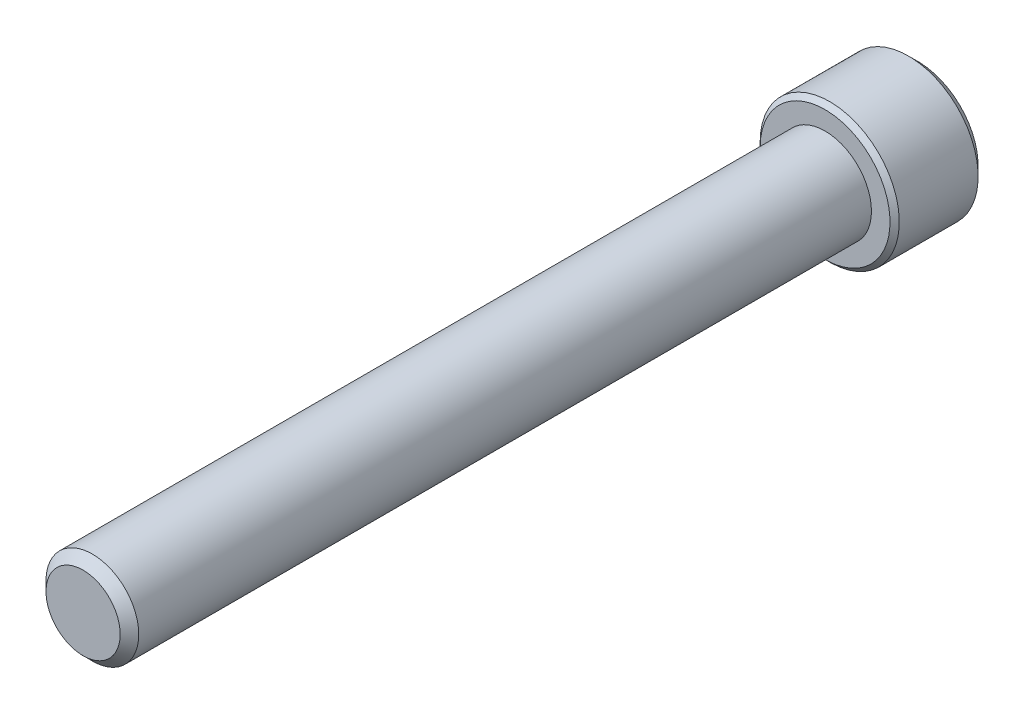
ISO-10303-21;
HEADER;
FILE_DESCRIPTION(('STEP AP214'),'2;1');
FILE_NAME('part.step','',(''),(''),'','','');
FILE_SCHEMA(('AUTOMOTIVE_DESIGN { 1 0 10303 214 1 1 1 1 }'));
ENDSEC;
DATA;
#1=APPLICATION_CONTEXT('core data for automotive mechanical design processes');
#2=APPLICATION_PROTOCOL_DEFINITION('international standard','automotive_design',2000,#1);
#3=PRODUCT_CONTEXT('',#1,'mechanical');
#4=PRODUCT('Part','Part','',(#3));
#5=PRODUCT_RELATED_PRODUCT_CATEGORY('part','',(#4));
#6=PRODUCT_DEFINITION_FORMATION('','',#4);
#7=PRODUCT_DEFINITION_CONTEXT('part definition',#1,'design');
#8=PRODUCT_DEFINITION('design','',#6,#7);
#9=PRODUCT_DEFINITION_SHAPE('','',#8);
#10=(LENGTH_UNIT() NAMED_UNIT(*) SI_UNIT(.MILLI.,.METRE.));
#11=(NAMED_UNIT(*) PLANE_ANGLE_UNIT() SI_UNIT($,.RADIAN.));
#12=(NAMED_UNIT(*) SI_UNIT($,.STERADIAN.) SOLID_ANGLE_UNIT());
#13=UNCERTAINTY_MEASURE_WITH_UNIT(LENGTH_MEASURE(1.E-05),#10,'distance_accuracy_value','');
#14=(GEOMETRIC_REPRESENTATION_CONTEXT(3) GLOBAL_UNCERTAINTY_ASSIGNED_CONTEXT((#13)) GLOBAL_UNIT_ASSIGNED_CONTEXT((#10,
#11,#12)) REPRESENTATION_CONTEXT('',''));
#15=CARTESIAN_POINT('',(0.,0.,0.));
#16=DIRECTION('',(0.,0.,1.));
#17=DIRECTION('',(1.,0.,0.));
#18=AXIS2_PLACEMENT_3D('',#15,#16,#17);
#19=CARTESIAN_POINT('',(0.,0.,-63.5));
#20=DIRECTION('',(0.,0.,1.));
#21=DIRECTION('',(1.,0.,0.));
#22=AXIS2_PLACEMENT_3D('',#19,#20,#21);
#23=CYLINDRICAL_SURFACE('',#22,3.96875);
#24=CARTESIAN_POINT('',(0.,0.,-63.5));
#25=DIRECTION('',(0.,0.,-1.));
#26=DIRECTION('',(-1.,0.,0.));
#27=AXIS2_PLACEMENT_3D('',#24,#25,#26);
#28=CIRCLE('',#27,3.96875);
#29=CARTESIAN_POINT('',(-3.96875,0.,-63.5));
#30=VERTEX_POINT('',#29);
#31=EDGE_CURVE('E210',#30,#30,#28,.F.);
#32=ORIENTED_EDGE('',*,*,#31,.T.);
#33=EDGE_LOOP('',(#32));
#34=FACE_BOUND('',#33,.T.);
#35=CARTESIAN_POINT('',(0.,0.,-0.793749999999996));
#36=DIRECTION('',(0.,0.,1.));
#37=DIRECTION('',(1.,0.,0.));
#38=AXIS2_PLACEMENT_3D('',#35,#36,#37);
#39=CIRCLE('',#38,3.96875);
#40=CARTESIAN_POINT('',(3.96875,0.,-0.793749999999996));
#41=VERTEX_POINT('',#40);
#42=EDGE_CURVE('E109',#41,#41,#39,.F.);
#43=ORIENTED_EDGE('',*,*,#42,.T.);
#44=EDGE_LOOP('',(#43));
#45=FACE_BOUND('',#44,.T.);
#46=ADVANCED_FACE('F35',(#34,#45),#23,.T.);
#47=CARTESIAN_POINT('',(0.,0.,0.));
#48=DIRECTION('',(0.,0.,1.));
#49=DIRECTION('',(1.,0.,0.));
#50=AXIS2_PLACEMENT_3D('',#47,#48,#49);
#51=PLANE('',#50);
#52=CARTESIAN_POINT('',(0.,0.,0.));
#53=DIRECTION('',(0.,0.,1.));
#54=DIRECTION('',(1.,0.,0.));
#55=AXIS2_PLACEMENT_3D('',#52,#53,#54);
#56=CIRCLE('',#55,3.175);
#57=CARTESIAN_POINT('',(3.175,0.,0.));
#58=VERTEX_POINT('',#57);
#59=EDGE_CURVE('E209',#58,#58,#56,.T.);
#60=ORIENTED_EDGE('',*,*,#59,.T.);
#61=EDGE_LOOP('',(#60));
#62=FACE_BOUND('',#61,.T.);
#63=ADVANCED_FACE('F186',(#62),#51,.T.);
#64=CARTESIAN_POINT('',(0.,0.,0.));
#65=DIRECTION('',(0.,0.,-1.));
#66=DIRECTION('',(-1.,0.,0.));
#67=AXIS2_PLACEMENT_3D('',#64,#65,#66);
#68=CONICAL_SURFACE('',#67,3.175,0.785398163397448);
#69=ORIENTED_EDGE('',*,*,#42,.F.);
#70=EDGE_LOOP('',(#69));
#71=FACE_BOUND('',#70,.T.);
#72=ORIENTED_EDGE('',*,*,#59,.F.);
#73=EDGE_LOOP('',(#72));
#74=FACE_BOUND('',#73,.T.);
#75=ADVANCED_FACE('F192',(#71,#74),#68,.T.);
#76=CARTESIAN_POINT('',(0.,0.,-71.4375));
#77=DIRECTION('',(0.,0.,1.));
#78=DIRECTION('',(1.,0.,0.));
#79=AXIS2_PLACEMENT_3D('',#76,#77,#78);
#80=CYLINDRICAL_SURFACE('',#79,5.953125);
#81=CARTESIAN_POINT('',(0.,0.,-63.896875));
#82=DIRECTION('',(0.,0.,-1.));
#83=DIRECTION('',(-1.,0.,0.));
#84=AXIS2_PLACEMENT_3D('',#81,#82,#83);
#85=CIRCLE('',#84,5.953125);
#86=CARTESIAN_POINT('',(-5.953125,0.,-63.896875));
#87=VERTEX_POINT('',#86);
#88=EDGE_CURVE('E43',#87,#87,#85,.T.);
#89=ORIENTED_EDGE('',*,*,#88,.T.);
#90=EDGE_LOOP('',(#89));
#91=FACE_BOUND('',#90,.T.);
#92=CARTESIAN_POINT('',(0.,0.,-70.64375));
#93=DIRECTION('',(0.,0.,-1.));
#94=DIRECTION('',(-1.,0.,0.));
#95=AXIS2_PLACEMENT_3D('',#92,#93,#94);
#96=CIRCLE('',#95,5.953125);
#97=CARTESIAN_POINT('',(-5.953125,0.,-70.64375));
#98=VERTEX_POINT('',#97);
#99=EDGE_CURVE('E169',#98,#98,#96,.F.);
#100=ORIENTED_EDGE('',*,*,#99,.T.);
#101=EDGE_LOOP('',(#100));
#102=FACE_BOUND('',#101,.T.);
#103=ADVANCED_FACE('F174',(#91,#102),#80,.T.);
#104=CARTESIAN_POINT('',(0.,0.,-71.4375));
#105=DIRECTION('',(0.,0.,-1.));
#106=DIRECTION('',(-1.,0.,0.));
#107=AXIS2_PLACEMENT_3D('',#104,#105,#106);
#108=PLANE('',#107);
#109=CARTESIAN_POINT('',(0.,0.,-71.4375));
#110=DIRECTION('',(0.,0.,-1.));
#111=DIRECTION('',(-1.,0.,0.));
#112=AXIS2_PLACEMENT_3D('',#109,#110,#111);
#113=CIRCLE('',#112,5.159375);
#114=CARTESIAN_POINT('',(-5.159375,0.,-71.4375));
#115=VERTEX_POINT('',#114);
#116=EDGE_CURVE('E108',#115,#115,#113,.T.);
#117=ORIENTED_EDGE('',*,*,#116,.T.);
#118=EDGE_LOOP('',(#117));
#119=FACE_BOUND('',#118,.T.);
#120=CARTESIAN_POINT('',(0.,0.,-71.4375));
#121=DIRECTION('',(0.,0.,-1.));
#122=DIRECTION('',(-1.,0.,0.));
#123=AXIS2_PLACEMENT_3D('',#120,#121,#122);
#124=CIRCLE('',#123,3.66617420935412);
#125=CARTESIAN_POINT('',(-3.175,1.83308710467706,-71.4375));
#126=VERTEX_POINT('',#125);
#127=CARTESIAN_POINT('',(0.,3.66617420935412,-71.4375));
#128=VERTEX_POINT('',#127);
#129=EDGE_CURVE('E89',#126,#128,#124,.T.);
#130=ORIENTED_EDGE('',*,*,#129,.F.);
#131=CARTESIAN_POINT('',(-3.175,-1.83308710467706,-71.4375));
#132=VERTEX_POINT('',#131);
#133=EDGE_CURVE('E49',#132,#126,#124,.T.);
#134=ORIENTED_EDGE('',*,*,#133,.F.);
#135=CARTESIAN_POINT('',(0.,-3.66617420935412,-71.4375));
#136=VERTEX_POINT('',#135);
#137=EDGE_CURVE('E265',#136,#132,#124,.T.);
#138=ORIENTED_EDGE('',*,*,#137,.F.);
#139=CARTESIAN_POINT('',(3.175,-1.83308710467706,-71.4375));
#140=VERTEX_POINT('',#139);
#141=EDGE_CURVE('E56',#140,#136,#124,.T.);
#142=ORIENTED_EDGE('',*,*,#141,.F.);
#143=CARTESIAN_POINT('',(3.175,1.83308710467706,-71.4375));
#144=VERTEX_POINT('',#143);
#145=EDGE_CURVE('E130',#144,#140,#124,.T.);
#146=ORIENTED_EDGE('',*,*,#145,.F.);
#147=EDGE_CURVE('E98',#128,#144,#124,.T.);
#148=ORIENTED_EDGE('',*,*,#147,.F.);
#149=EDGE_LOOP('',(#130,#134,#138,#142,#146,#148));
#150=FACE_BOUND('',#149,.T.);
#151=ADVANCED_FACE('F129',(#119,#150),#108,.T.);
#152=CARTESIAN_POINT('',(0.,0.,-63.5));
#153=DIRECTION('',(0.,0.,-1.));
#154=DIRECTION('',(-1.,0.,0.));
#155=AXIS2_PLACEMENT_3D('',#152,#153,#154);
#156=PLANE('',#155);
#157=CARTESIAN_POINT('',(0.,0.,-63.5));
#158=DIRECTION('',(0.,0.,-1.));
#159=DIRECTION('',(-1.,0.,0.));
#160=AXIS2_PLACEMENT_3D('',#157,#158,#159);
#161=CIRCLE('',#160,5.55625);
#162=CARTESIAN_POINT('',(-5.55625,0.,-63.5));
#163=VERTEX_POINT('',#162);
#164=EDGE_CURVE('E11',#163,#163,#161,.F.);
#165=ORIENTED_EDGE('',*,*,#164,.T.);
#166=EDGE_LOOP('',(#165));
#167=FACE_BOUND('',#166,.T.);
#168=ORIENTED_EDGE('',*,*,#31,.F.);
#169=EDGE_LOOP('',(#168));
#170=FACE_BOUND('',#169,.T.);
#171=ADVANCED_FACE('F277',(#167,#170),#156,.F.);
#172=CARTESIAN_POINT('',(0.,0.,-71.4375));
#173=DIRECTION('',(0.,0.,-1.));
#174=DIRECTION('',(-1.,0.,0.));
#175=AXIS2_PLACEMENT_3D('',#172,#173,#174);
#176=CONICAL_SURFACE('',#175,3.66617420935412,0.78539816339745);
#177=ORIENTED_EDGE('',*,*,#147,.T.);
#178=CARTESIAN_POINT('',(-0.000200000000000376,3.66628967940796,-71.4376154755089));
#179=CARTESIAN_POINT('',(0.108938349949823,3.60327862368552,-71.3746589836918));
#180=CARTESIAN_POINT('',(0.21990162807794,3.53921394518809,-71.3154001042347));
#181=CARTESIAN_POINT('',(0.44616784634594,3.40857908316254,-71.2068986557306));
#182=CARTESIAN_POINT('',(0.561492303252257,3.34199647692353,-71.1577164539387));
#183=CARTESIAN_POINT('',(0.79403852248062,3.207735854653,-71.073466458874));
#184=CARTESIAN_POINT('',(0.911201066281143,3.14009202845083,-71.0381869144994));
#185=CARTESIAN_POINT('',(1.14810544464627,3.00331522182952,-70.9838315701348));
#186=CARTESIAN_POINT('',(1.26784004264354,2.93418641944449,-70.9647151975296));
#187=CARTESIAN_POINT('',(1.47419791875157,2.81504564412412,-70.9474671306233));
#188=CARTESIAN_POINT('',(1.56055470772915,2.76518752876156,-70.9449139336138));
#189=CARTESIAN_POINT('',(1.73312781652471,2.66555239794356,-70.9492162731233));
#190=CARTESIAN_POINT('',(1.81934407649279,2.61577541704246,-70.9560751080215));
#191=CARTESIAN_POINT('',(1.99095979158712,2.51669303773558,-70.9788098833037));
#192=CARTESIAN_POINT('',(2.07635822425326,2.46738822964741,-70.9946959096873));
#193=CARTESIAN_POINT('',(2.24568840330546,2.36962540518969,-71.034617983998));
#194=CARTESIAN_POINT('',(2.32962026161974,2.32116732419836,-71.0586534070852));
#195=CARTESIAN_POINT('',(2.47862357928411,2.23514021863469,-71.1081052344172));
#196=CARTESIAN_POINT('',(2.54402485119173,2.19738077669348,-71.132221719301));
#197=CARTESIAN_POINT('',(2.6736532502051,2.12253978562849,-71.1843414671371));
#198=CARTESIAN_POINT('',(2.73788034144172,2.08545825721376,-71.2123448486035));
#199=CARTESIAN_POINT('',(2.8649580345126,2.01208991691129,-71.2716105655445));
#200=CARTESIAN_POINT('',(2.92781225074872,1.97580101824767,-71.3028626533542));
#201=CARTESIAN_POINT('',(3.05235662084809,1.90389529264474,-71.3682153443919));
#202=CARTESIAN_POINT('',(3.11404746097871,1.8682780694888,-71.4023141995185));
#203=CARTESIAN_POINT('',(3.1752,1.83297163462322,-71.4376154755089));
#204=B_SPLINE_CURVE_WITH_KNOTS('',3,(#178,#179,#180,#181,#182,#183,#184,#185,#186,#187,#188,
#189,#190,#191,#192,#193,#194,#195,#196,#197,#198,#199,#200,#201,#202,#203),.UNSPECIFIED.,.F.,
.F.,(4,2,2,2,2,2,2,2,2,2,2,2,4),(0.,0.4229105724368,0.848285055427804,1.26690402276126,
1.68446903107505,1.98329272958351,2.28222117546889,2.58148426995465,2.88072442418451,
3.11844134429545,3.35616551414404,3.59316134346766,3.8300126974443),.UNSPECIFIED.);
#205=EDGE_CURVE('E103',#128,#144,#204,.T.);
#206=ORIENTED_EDGE('',*,*,#205,.F.);
#207=EDGE_LOOP('',(#177,#206));
#208=FACE_BOUND('',#207,.T.);
#209=ADVANCED_FACE('F104',(#208),#176,.F.);
#210=ORIENTED_EDGE('',*,*,#145,.T.);
#211=CARTESIAN_POINT('',(3.175,-3.70444383584785,-72.6502118451619));
#212=CARTESIAN_POINT('',(3.175,-3.61446006856654,-72.5819043948676));
#213=CARTESIAN_POINT('',(3.175,-3.52397795214463,-72.5142428612445));
#214=CARTESIAN_POINT('',(3.175,-3.34181836123848,-72.3805025492024));
#215=CARTESIAN_POINT('',(3.175,-3.250140597284,-72.3144241654826));
#216=CARTESIAN_POINT('',(3.175,-3.06472035593929,-72.1836709408018));
#217=CARTESIAN_POINT('',(3.175,-2.97096738900307,-72.1190109250879));
#218=CARTESIAN_POINT('',(3.175,-2.78187869931256,-71.9920558022517));
#219=CARTESIAN_POINT('',(3.175,-2.68654308817008,-71.929760529372));
#220=CARTESIAN_POINT('',(3.175,-2.48836016870252,-71.8044784446062));
#221=CARTESIAN_POINT('',(3.175,-2.38540128536647,-71.7416672392123));
#222=CARTESIAN_POINT('',(3.175,-2.17707529026742,-71.6201078544743));
#223=CARTESIAN_POINT('',(3.175,-2.07170779370642,-71.561360330462));
#224=CARTESIAN_POINT('',(3.175,-1.85856318748113,-71.4491912176541));
#225=CARTESIAN_POINT('',(3.175,-1.75079438294671,-71.3957539709329));
#226=CARTESIAN_POINT('',(3.175,-1.53228582600747,-71.2954020450525));
#227=CARTESIAN_POINT('',(3.175,-1.4215474633634,-71.2484843761431));
#228=CARTESIAN_POINT('',(3.175,-1.20656057350992,-71.166530034464));
#229=CARTESIAN_POINT('',(3.175,-1.10257181507286,-71.1308189415949));
#230=CARTESIAN_POINT('',(3.175,-0.892048260878873,-71.0677329725217));
#231=CARTESIAN_POINT('',(3.175,-0.785513294311067,-71.0403586572879));
#232=CARTESIAN_POINT('',(3.175,-0.572329012717395,-70.9958460023287));
#233=CARTESIAN_POINT('',(3.175,-0.465717564636556,-70.9785292889145));
#234=CARTESIAN_POINT('',(3.175,-0.251301383583118,-70.9544756602937));
#235=CARTESIAN_POINT('',(3.175,-0.143496870917766,-70.9477368235873));
#236=CARTESIAN_POINT('',(3.175,0.0681069951827619,-70.9453609564692));
#237=CARTESIAN_POINT('',(3.175,0.17190181363865,-70.9493091223896));
#238=CARTESIAN_POINT('',(3.175,0.378625872879034,-70.9671624071181));
#239=CARTESIAN_POINT('',(3.175,0.481555030095566,-70.9810684763143));
#240=CARTESIAN_POINT('',(3.175,0.687543944903112,-71.0183074222191));
#241=CARTESIAN_POINT('',(3.175,0.790573911747977,-71.0418024293294));
#242=CARTESIAN_POINT('',(3.175,0.994382635323689,-71.0969517792585));
#243=CARTESIAN_POINT('',(3.175,1.09516156281328,-71.1286055008759));
#244=CARTESIAN_POINT('',(3.175,1.30251417649916,-71.2016294931737));
#245=CARTESIAN_POINT('',(3.175,1.40887912364162,-71.2435863005657));
#246=CARTESIAN_POINT('',(3.175,1.61884111284847,-71.3339490627203));
#247=CARTESIAN_POINT('',(3.175,1.72243722600422,-71.3823571499939));
#248=CARTESIAN_POINT('',(3.175,1.92738358083042,-71.4844798355874));
#249=CARTESIAN_POINT('',(3.175,2.02872533588121,-71.538211328075));
#250=CARTESIAN_POINT('',(3.175,2.22907994672306,-71.6497921629552));
#251=CARTESIAN_POINT('',(3.175,2.32809316592037,-71.7076408570403));
#252=CARTESIAN_POINT('',(3.175,2.51923503723042,-71.8236949409625));
#253=CARTESIAN_POINT('',(3.175,2.61146147877823,-71.8817401210939));
#254=CARTESIAN_POINT('',(3.175,2.79433061473592,-72.000281230002));
#255=CARTESIAN_POINT('',(3.175,2.88497318880336,-72.060777343852));
#256=CARTESIAN_POINT('',(3.175,3.06414875022217,-72.1832851399095));
#257=CARTESIAN_POINT('',(3.175,3.15269287411231,-72.2452805926272));
#258=CARTESIAN_POINT('',(3.175,3.32856950185137,-72.3709183631728));
#259=CARTESIAN_POINT('',(3.175,3.41590233249718,-72.4345602229942));
#260=CARTESIAN_POINT('',(3.175,3.50272764399219,-72.4988754675913));
#261=B_SPLINE_CURVE_WITH_KNOTS('',3,(#211,#212,#213,#214,#215,#216,#217,#218,#219,#220,#221,
#222,#223,#224,#225,#226,#227,#228,#229,#230,#231,#232,#233,#234,#235,#236,#237,#238,#239,#240,
#241,#242,#243,#244,#245,#246,#247,#248,#249,#250,#251,#252,#253,#254,#255,#256,#257,#258,#259,
#260),.UNSPECIFIED.,.F.,.F.,(4,2,2,2,2,2,2,2,2,2,2,2,2,2,2,2,2,2,2,2,2,2,2,2,4),(0.,
0.33892672291792,0.677937083279504,1.01957183491539,1.36118259515686,1.72292567400707,
2.08472695420016,2.44542763005297,2.8059623458982,3.13552343983682,3.46510670458908,
3.78865064563719,4.11213580725538,4.42324708341663,4.73438805617944,5.05102342839298,
5.36763469922675,5.71039210015347,6.05326308403165,6.39725934486604,6.74120155829905,
7.06807292474689,7.39496901986436,7.71921932182543,8.04338037199421),.UNSPECIFIED.);
#262=EDGE_CURVE('E97',#144,#140,#261,.F.);
#263=ORIENTED_EDGE('',*,*,#262,.F.);
#264=EDGE_LOOP('',(#210,#263));
#265=FACE_BOUND('',#264,.T.);
#266=ADVANCED_FACE('F271',(#265),#176,.F.);
#267=ORIENTED_EDGE('',*,*,#141,.T.);
#268=CARTESIAN_POINT('',(3.1752,-1.83297163462322,-71.4376154755089));
#269=CARTESIAN_POINT('',(3.06606165005018,-1.89598269034567,-71.3746589836918));
#270=CARTESIAN_POINT('',(2.95509837192206,-1.9600473688431,-71.3154001042347));
#271=CARTESIAN_POINT('',(2.72883215365406,-2.09068223086865,-71.2068986557306));
#272=CARTESIAN_POINT('',(2.61350769674774,-2.15726483710766,-71.1577164539387));
#273=CARTESIAN_POINT('',(2.38096147751938,-2.29152545937818,-71.073466458874));
#274=CARTESIAN_POINT('',(2.26379893371886,-2.35916928558035,-71.0381869144994));
#275=CARTESIAN_POINT('',(2.02689455535373,-2.49594609220166,-70.9838315701348));
#276=CARTESIAN_POINT('',(1.90715995735646,-2.5650748945867,-70.9647151975296));
#277=CARTESIAN_POINT('',(1.70080208124843,-2.68421566990707,-70.9474671306233));
#278=CARTESIAN_POINT('',(1.61444529227086,-2.73407378526962,-70.9449139336138));
#279=CARTESIAN_POINT('',(1.4418721834753,-2.83370891608763,-70.9492162731233));
#280=CARTESIAN_POINT('',(1.35565592350721,-2.88348589698873,-70.9560751080215));
#281=CARTESIAN_POINT('',(1.18404020841288,-2.98256827629561,-70.9788098833037));
#282=CARTESIAN_POINT('',(1.09864177574674,-3.03187308438378,-70.9946959096873));
#283=CARTESIAN_POINT('',(0.929311596694537,-3.12963590884149,-71.034617983998));
#284=CARTESIAN_POINT('',(0.845379738380263,-3.17809398983282,-71.0586534070852));
#285=CARTESIAN_POINT('',(0.696376420715894,-3.26412109539649,-71.1081052344172));
#286=CARTESIAN_POINT('',(0.630975148808275,-3.3018805373377,-71.132221719301));
#287=CARTESIAN_POINT('',(0.501346749794898,-3.3767215284027,-71.1843414671371));
#288=CARTESIAN_POINT('',(0.437119658558281,-3.41380305681742,-71.2123448486035));
#289=CARTESIAN_POINT('',(0.310041965487405,-3.48717139711989,-71.2716105655445));
#290=CARTESIAN_POINT('',(0.247187749251281,-3.52346029578352,-71.3028626533542));
#291=CARTESIAN_POINT('',(0.122643379151911,-3.59536602138644,-71.3682153443919));
#292=CARTESIAN_POINT('',(0.0609525390212935,-3.63098324454239,-71.4023141995185));
#293=CARTESIAN_POINT('',(-0.000200000000000854,-3.66628967940796,-71.4376154755089));
#294=B_SPLINE_CURVE_WITH_KNOTS('',3,(#268,#269,#270,#271,#272,#273,#274,#275,#276,#277,#278,
#279,#280,#281,#282,#283,#284,#285,#286,#287,#288,#289,#290,#291,#292,#293),.UNSPECIFIED.,.F.,
.F.,(4,2,2,2,2,2,2,2,2,2,2,2,4),(0.,0.422910572436801,0.848285055427804,1.26690402276126,
1.68446903107505,1.98329272958351,2.28222117546889,2.58148426995465,2.88072442418451,
3.11844134429545,3.35616551414404,3.59316134346766,3.8300126974443),.UNSPECIFIED.);
#295=EDGE_CURVE('E139',#140,#136,#294,.T.);
#296=ORIENTED_EDGE('',*,*,#295,.F.);
#297=EDGE_LOOP('',(#267,#296));
#298=FACE_BOUND('',#297,.T.);
#299=ADVANCED_FACE('F268',(#298),#176,.F.);
#300=ORIENTED_EDGE('',*,*,#137,.T.);
#301=CARTESIAN_POINT('',(0.000200000000001931,-3.66628967940796,-71.4376154755089));
#302=CARTESIAN_POINT('',(-0.108938349949822,-3.60327862368552,-71.3746589836918));
#303=CARTESIAN_POINT('',(-0.219901628077938,-3.53921394518809,-71.3154001042347));
#304=CARTESIAN_POINT('',(-0.446167846345938,-3.40857908316254,-71.2068986557306));
#305=CARTESIAN_POINT('',(-0.561492303252255,-3.34199647692353,-71.1577164539387));
#306=CARTESIAN_POINT('',(-0.79403852248062,-3.207735854653,-71.073466458874));
#307=CARTESIAN_POINT('',(-0.911201066281145,-3.14009202845083,-71.0381869144994));
#308=CARTESIAN_POINT('',(-1.14810544464627,-3.00331522182952,-70.9838315701348));
#309=CARTESIAN_POINT('',(-1.26784004264354,-2.93418641944449,-70.9647151975296));
#310=CARTESIAN_POINT('',(-1.47419791875157,-2.81504564412412,-70.9474671306233));
#311=CARTESIAN_POINT('',(-1.56055470772914,-2.76518752876156,-70.9449139336138));
#312=CARTESIAN_POINT('',(-1.73312781652471,-2.66555239794356,-70.9492162731233));
#313=CARTESIAN_POINT('',(-1.81934407649279,-2.61577541704246,-70.9560751080215));
#314=CARTESIAN_POINT('',(-1.99095979158712,-2.51669303773558,-70.9788098833037));
#315=CARTESIAN_POINT('',(-2.07635822425326,-2.46738822964741,-70.9946959096873));
#316=CARTESIAN_POINT('',(-2.24568840330546,-2.36962540518969,-71.034617983998));
#317=CARTESIAN_POINT('',(-2.32962026161974,-2.32116732419836,-71.0586534070852));
#318=CARTESIAN_POINT('',(-2.47862357928411,-2.23514021863469,-71.1081052344172));
#319=CARTESIAN_POINT('',(-2.54402485119173,-2.19738077669348,-71.132221719301));
#320=CARTESIAN_POINT('',(-2.6736532502051,-2.12253978562849,-71.1843414671371));
#321=CARTESIAN_POINT('',(-2.73788034144172,-2.08545825721376,-71.2123448486035));
#322=CARTESIAN_POINT('',(-2.8649580345126,-2.0120899169113,-71.2716105655445));
#323=CARTESIAN_POINT('',(-2.92781225074872,-1.97580101824767,-71.3028626533542));
#324=CARTESIAN_POINT('',(-3.05235662084809,-1.90389529264474,-71.3682153443919));
#325=CARTESIAN_POINT('',(-3.11404746097871,-1.8682780694888,-71.4023141995185));
#326=CARTESIAN_POINT('',(-3.1752,-1.83297163462322,-71.4376154755089));
#327=B_SPLINE_CURVE_WITH_KNOTS('',3,(#301,#302,#303,#304,#305,#306,#307,#308,#309,#310,#311,
#312,#313,#314,#315,#316,#317,#318,#319,#320,#321,#322,#323,#324,#325,#326),.UNSPECIFIED.,.F.,
.F.,(4,2,2,2,2,2,2,2,2,2,2,2,4),(0.,0.422910572436801,0.848285055427804,1.26690402276127,
1.68446903107505,1.98329272958351,2.28222117546889,2.58148426995465,2.88072442418451,
3.11844134429546,3.35616551414404,3.59316134346766,3.8300126974443),.UNSPECIFIED.);
#328=EDGE_CURVE('E243',#136,#132,#327,.T.);
#329=ORIENTED_EDGE('',*,*,#328,.F.);
#330=EDGE_LOOP('',(#300,#329));
#331=FACE_BOUND('',#330,.T.);
#332=ADVANCED_FACE('F267',(#331),#176,.F.);
#333=ORIENTED_EDGE('',*,*,#133,.T.);
#334=CARTESIAN_POINT('',(-3.175,-3.70444383603084,-72.6502118453009));
#335=CARTESIAN_POINT('',(-3.175,-3.61446006874435,-72.5819043950012));
#336=CARTESIAN_POINT('',(-3.175,-3.52397795231724,-72.5142428613727));
#337=CARTESIAN_POINT('',(-3.175,-3.34181836140065,-72.38050254932));
#338=CARTESIAN_POINT('',(-3.175,-3.25014059744093,-72.3144241655949));
#339=CARTESIAN_POINT('',(-3.175,-3.06472035608554,-72.1836709409034));
#340=CARTESIAN_POINT('',(-3.175,-2.9709673891439,-72.1190109251841));
#341=CARTESIAN_POINT('',(-3.175,-2.78187869944245,-71.9920558023373));
#342=CARTESIAN_POINT('',(-3.175,-2.68654308829446,-71.9297605294523));
#343=CARTESIAN_POINT('',(-3.175,-2.488360168815,-71.8044784446755));
#344=CARTESIAN_POINT('',(-3.175,-2.38540128547254,-71.741667239276));
#345=CARTESIAN_POINT('',(-3.175,-2.17707529036045,-71.6201078545269));
#346=CARTESIAN_POINT('',(-3.175,-2.07170779379281,-71.5613603305091));
#347=CARTESIAN_POINT('',(-3.175,-1.85856318755402,-71.4491912176908));
#348=CARTESIAN_POINT('',(-3.175,-1.75079438301273,-71.3957539709646));
#349=CARTESIAN_POINT('',(-3.175,-1.53228582605938,-71.2954020450749));
#350=CARTESIAN_POINT('',(-3.175,-1.42154746340807,-71.2484843761612));
#351=CARTESIAN_POINT('',(-3.175,-1.20656057355149,-71.166530034479));
#352=CARTESIAN_POINT('',(-3.175,-1.1025718151189,-71.1308189416102));
#353=CARTESIAN_POINT('',(-3.175,-0.892048260933987,-71.0677329725368));
#354=CARTESIAN_POINT('',(-3.175,-0.785513294370796,-71.0403586573024));
#355=CARTESIAN_POINT('',(-3.175,-0.572329012786206,-70.9958460023411));
#356=CARTESIAN_POINT('',(-3.175,-0.465717564709832,-70.9785292889254));
#357=CARTESIAN_POINT('',(-3.175,-0.251301383665184,-70.9544756603003));
#358=CARTESIAN_POINT('',(-3.175,-0.143496871004156,-70.9477368235913));
#359=CARTESIAN_POINT('',(-3.175,0.0681069950885781,-70.9453609564673));
#360=CARTESIAN_POINT('',(-3.175,0.171901813540985,-70.9493091223844));
#361=CARTESIAN_POINT('',(-3.175,0.378625872774768,-70.9671624071059));
#362=CARTESIAN_POINT('',(-3.175,0.481555029988178,-70.9810684762983));
#363=CARTESIAN_POINT('',(-3.175,0.687543944789566,-71.0183074221952));
#364=CARTESIAN_POINT('',(-3.175,0.790573911631403,-71.0418024293013));
#365=CARTESIAN_POINT('',(-3.175,0.994382635201358,-71.096951779222));
#366=CARTESIAN_POINT('',(-3.175,1.09516156268822,-71.1286055008352));
#367=CARTESIAN_POINT('',(-3.175,1.30251417635927,-71.2016294931208));
#368=CARTESIAN_POINT('',(-3.175,1.40887912348989,-71.2435863005044));
#369=CARTESIAN_POINT('',(-3.175,1.61884111267366,-71.3339490626411));
#370=CARTESIAN_POINT('',(-3.175,1.72243722581818,-71.3823571499053));
#371=CARTESIAN_POINT('',(-3.175,1.92738358062232,-71.4844798354796));
#372=CARTESIAN_POINT('',(-3.175,2.02872533566227,-71.5382113279572));
#373=CARTESIAN_POINT('',(-3.175,2.22907994648283,-71.6497921628173));
#374=CARTESIAN_POINT('',(-3.175,2.32809316566966,-71.7076408568921));
#375=CARTESIAN_POINT('',(-3.175,2.51923503696069,-71.8236949407949));
#376=CARTESIAN_POINT('',(-3.175,2.61146147849992,-71.8817401209171));
#377=CARTESIAN_POINT('',(-3.175,2.79433061444055,-72.0002812298069));
#378=CARTESIAN_POINT('',(-3.175,2.88497318849951,-72.0607773436477));
#379=CARTESIAN_POINT('',(-3.175,3.06414874990159,-72.1832851396869));
#380=CARTESIAN_POINT('',(-3.175,3.15269287378347,-72.2452805923955));
#381=CARTESIAN_POINT('',(-3.175,3.32856950150606,-72.3709183629229));
#382=CARTESIAN_POINT('',(-3.175,3.41590233214366,-72.4345602227352));
#383=CARTESIAN_POINT('',(-3.175,3.50272764363047,-72.4988754673233));
#384=B_SPLINE_CURVE_WITH_KNOTS('',3,(#334,#335,#336,#337,#338,#339,#340,#341,#342,#343,#344,
#345,#346,#347,#348,#349,#350,#351,#352,#353,#354,#355,#356,#357,#358,#359,#360,#361,#362,#363,
#364,#365,#366,#367,#368,#369,#370,#371,#372,#373,#374,#375,#376,#377,#378,#379,#380,#381,#382,
#383),.UNSPECIFIED.,.F.,.F.,(4,2,2,2,2,2,2,2,2,2,2,2,2,2,2,2,2,2,2,2,2,2,2,2,4),(0.,
0.338926722940025,0.677937083323717,1.01957183498211,1.36118259524609,1.72292567412157,
2.08472695433995,2.44542763021784,2.80596234608811,3.13552344001376,3.4651067047531,
3.78865064578882,4.11213580739462,4.42324708354511,4.73438805629714,5.05102342849906,
5.36763469932119,5.71039210020557,6.05326308404135,6.39725934483309,6.74120155822349,
7.06807292463489,7.39496901971592,7.71921932164104,8.04338037177387),.UNSPECIFIED.);
#385=EDGE_CURVE('E119',#132,#126,#384,.T.);
#386=ORIENTED_EDGE('',*,*,#385,.F.);
#387=EDGE_LOOP('',(#333,#386));
#388=FACE_BOUND('',#387,.T.);
#389=ADVANCED_FACE('F284',(#388),#176,.F.);
#390=ORIENTED_EDGE('',*,*,#129,.T.);
#391=CARTESIAN_POINT('',(-3.1752,1.83297163462322,-71.4376154755089));
#392=CARTESIAN_POINT('',(-3.06606165005018,1.89598269034566,-71.3746589836918));
#393=CARTESIAN_POINT('',(-2.95509837192206,1.9600473688431,-71.3154001042347));
#394=CARTESIAN_POINT('',(-2.72883215365406,2.09068223086864,-71.2068986557306));
#395=CARTESIAN_POINT('',(-2.61350769674775,2.15726483710765,-71.1577164539387));
#396=CARTESIAN_POINT('',(-2.38096147751938,2.29152545937818,-71.073466458874));
#397=CARTESIAN_POINT('',(-2.26379893371886,2.35916928558035,-71.0381869144994));
#398=CARTESIAN_POINT('',(-2.02689455535373,2.49594609220166,-70.9838315701348));
#399=CARTESIAN_POINT('',(-1.90715995735646,2.5650748945867,-70.9647151975296));
#400=CARTESIAN_POINT('',(-1.70080208124843,2.68421566990707,-70.9474671306233));
#401=CARTESIAN_POINT('',(-1.61444529227086,2.73407378526962,-70.9449139336138));
#402=CARTESIAN_POINT('',(-1.44187218347529,2.83370891608763,-70.9492162731233));
#403=CARTESIAN_POINT('',(-1.35565592350721,2.88348589698873,-70.9560751080215));
#404=CARTESIAN_POINT('',(-1.18404020841288,2.9825682762956,-70.9788098833037));
#405=CARTESIAN_POINT('',(-1.09864177574674,3.03187308438378,-70.9946959096873));
#406=CARTESIAN_POINT('',(-0.929311596694537,3.12963590884149,-71.0346179839979));
#407=CARTESIAN_POINT('',(-0.845379738380261,3.17809398983282,-71.0586534070852));
#408=CARTESIAN_POINT('',(-0.696376420715894,3.26412109539649,-71.1081052344172));
#409=CARTESIAN_POINT('',(-0.630975148808279,3.3018805373377,-71.132221719301));
#410=CARTESIAN_POINT('',(-0.501346749794902,3.37672152840269,-71.1843414671371));
#411=CARTESIAN_POINT('',(-0.437119658558282,3.41380305681742,-71.2123448486035));
#412=CARTESIAN_POINT('',(-0.310041965487402,3.48717139711989,-71.2716105655445));
#413=CARTESIAN_POINT('',(-0.247187749251277,3.52346029578352,-71.3028626533542));
#414=CARTESIAN_POINT('',(-0.122643379151908,3.59536602138644,-71.3682153443919));
#415=CARTESIAN_POINT('',(-0.060952539021291,3.63098324454239,-71.4023141995185));
#416=CARTESIAN_POINT('',(0.000200000000001984,3.66628967940796,-71.4376154755089));
#417=B_SPLINE_CURVE_WITH_KNOTS('',3,(#391,#392,#393,#394,#395,#396,#397,#398,#399,#400,#401,
#402,#403,#404,#405,#406,#407,#408,#409,#410,#411,#412,#413,#414,#415,#416),.UNSPECIFIED.,.F.,
.F.,(4,2,2,2,2,2,2,2,2,2,2,2,4),(0.,0.422910572436798,0.848285055427799,1.26690402276127,
1.68446903107505,1.98329272958351,2.28222117546889,2.58148426995464,2.8807244241845,
3.11844134429545,3.35616551414404,3.59316134346767,3.8300126974443),.UNSPECIFIED.);
#418=EDGE_CURVE('E93',#126,#128,#417,.T.);
#419=ORIENTED_EDGE('',*,*,#418,.F.);
#420=EDGE_LOOP('',(#390,#419));
#421=FACE_BOUND('',#420,.T.);
#422=ADVANCED_FACE('F91',(#421),#176,.F.);
#423=CARTESIAN_POINT('',(3.175,5.49926131403118,-66.675));
#424=DIRECTION('',(0.,0.,-1.));
#425=DIRECTION('',(-1.,0.,0.));
#426=AXIS2_PLACEMENT_3D('',#423,#424,#425);
#427=PLANE('',#426);
#428=DIRECTION('',(0.866025403784439,0.5,0.));
#429=VECTOR('',#428,1.);
#430=CARTESIAN_POINT('',(-3.175,1.83308710467706,-66.675));
#431=LINE('',#430,#429);
#432=CARTESIAN_POINT('',(-3.175,1.83308710467706,-66.675));
#433=VERTEX_POINT('',#432);
#434=CARTESIAN_POINT('',(0.,3.66617420935412,-66.675));
#435=VERTEX_POINT('',#434);
#436=EDGE_CURVE('E118',#433,#435,#431,.T.);
#437=ORIENTED_EDGE('',*,*,#436,.T.);
#438=DIRECTION('',(0.866025403784439,-0.5,0.));
#439=VECTOR('',#438,1.);
#440=CARTESIAN_POINT('',(0.,3.66617420935412,-66.675));
#441=LINE('',#440,#439);
#442=CARTESIAN_POINT('',(3.175,1.83308710467706,-66.675));
#443=VERTEX_POINT('',#442);
#444=EDGE_CURVE('E123',#435,#443,#441,.T.);
#445=ORIENTED_EDGE('',*,*,#444,.T.);
#446=DIRECTION('',(0.,-1.,0.));
#447=VECTOR('',#446,1.);
#448=CARTESIAN_POINT('',(3.175,1.83308710467706,-66.675));
#449=LINE('',#448,#447);
#450=CARTESIAN_POINT('',(3.175,-1.83308710467706,-66.675));
#451=VERTEX_POINT('',#450);
#452=EDGE_CURVE('E231',#443,#451,#449,.T.);
#453=ORIENTED_EDGE('',*,*,#452,.T.);
#454=DIRECTION('',(-0.866025403784439,-0.5,0.));
#455=VECTOR('',#454,1.);
#456=CARTESIAN_POINT('',(3.175,-1.83308710467706,-66.675));
#457=LINE('',#456,#455);
#458=CARTESIAN_POINT('',(0.,-3.66617420935412,-66.675));
#459=VERTEX_POINT('',#458);
#460=EDGE_CURVE('E228',#451,#459,#457,.T.);
#461=ORIENTED_EDGE('',*,*,#460,.T.);
#462=DIRECTION('',(-0.866025403784439,0.5,0.));
#463=VECTOR('',#462,1.);
#464=CARTESIAN_POINT('',(0.,-3.66617420935412,-66.675));
#465=LINE('',#464,#463);
#466=CARTESIAN_POINT('',(-3.175,-1.83308710467706,-66.675));
#467=VERTEX_POINT('',#466);
#468=EDGE_CURVE('E225',#459,#467,#465,.T.);
#469=ORIENTED_EDGE('',*,*,#468,.T.);
#470=DIRECTION('',(0.,1.,0.));
#471=VECTOR('',#470,1.);
#472=CARTESIAN_POINT('',(-3.175,-1.83308710467706,-66.675));
#473=LINE('',#472,#471);
#474=EDGE_CURVE('E126',#467,#433,#473,.T.);
#475=ORIENTED_EDGE('',*,*,#474,.T.);
#476=EDGE_LOOP('',(#437,#445,#453,#461,#469,#475));
#477=FACE_BOUND('',#476,.T.);
#478=ADVANCED_FACE('F158',(#477),#427,.T.);
#479=CARTESIAN_POINT('',(0.,3.66617420935412,-66.675));
#480=DIRECTION('',(0.5,0.866025403784439,0.));
#481=DIRECTION('',(-0.866025403784439,0.5,0.));
#482=AXIS2_PLACEMENT_3D('',#479,#480,#481);
#483=PLANE('',#482);
#484=DIRECTION('',(0.,0.,-1.));
#485=VECTOR('',#484,1.);
#486=CARTESIAN_POINT('',(0.,3.66617420935412,-66.675));
#487=LINE('',#486,#485);
#488=EDGE_CURVE('E115',#435,#128,#487,.T.);
#489=ORIENTED_EDGE('',*,*,#488,.T.);
#490=ORIENTED_EDGE('',*,*,#205,.T.);
#491=DIRECTION('',(0.,0.,-1.));
#492=VECTOR('',#491,1.);
#493=CARTESIAN_POINT('',(3.175,1.83308710467706,-66.675));
#494=LINE('',#493,#492);
#495=EDGE_CURVE('E125',#443,#144,#494,.T.);
#496=ORIENTED_EDGE('',*,*,#495,.F.);
#497=ORIENTED_EDGE('',*,*,#444,.F.);
#498=EDGE_LOOP('',(#489,#490,#496,#497));
#499=FACE_BOUND('',#498,.T.);
#500=ADVANCED_FACE('F121',(#499),#483,.F.);
#501=CARTESIAN_POINT('',(3.175,1.83308710467706,-66.675));
#502=DIRECTION('',(1.,0.,0.));
#503=DIRECTION('',(0.,0.,-1.));
#504=AXIS2_PLACEMENT_3D('',#501,#502,#503);
#505=PLANE('',#504);
#506=ORIENTED_EDGE('',*,*,#495,.T.);
#507=ORIENTED_EDGE('',*,*,#262,.T.);
#508=DIRECTION('',(0.,0.,-1.));
#509=VECTOR('',#508,1.);
#510=CARTESIAN_POINT('',(3.175,-1.83308710467706,-66.675));
#511=LINE('',#510,#509);
#512=EDGE_CURVE('E214',#451,#140,#511,.T.);
#513=ORIENTED_EDGE('',*,*,#512,.F.);
#514=ORIENTED_EDGE('',*,*,#452,.F.);
#515=EDGE_LOOP('',(#506,#507,#513,#514));
#516=FACE_BOUND('',#515,.T.);
#517=ADVANCED_FACE('F147',(#516),#505,.F.);
#518=CARTESIAN_POINT('',(3.175,-1.83308710467706,-66.675));
#519=DIRECTION('',(0.5,-0.866025403784439,0.));
#520=DIRECTION('',(0.866025403784439,0.5,0.));
#521=AXIS2_PLACEMENT_3D('',#518,#519,#520);
#522=PLANE('',#521);
#523=ORIENTED_EDGE('',*,*,#512,.T.);
#524=ORIENTED_EDGE('',*,*,#295,.T.);
#525=DIRECTION('',(0.,0.,-1.));
#526=VECTOR('',#525,1.);
#527=CARTESIAN_POINT('',(0.,-3.66617420935412,-66.675));
#528=LINE('',#527,#526);
#529=EDGE_CURVE('E217',#459,#136,#528,.T.);
#530=ORIENTED_EDGE('',*,*,#529,.F.);
#531=ORIENTED_EDGE('',*,*,#460,.F.);
#532=EDGE_LOOP('',(#523,#524,#530,#531));
#533=FACE_BOUND('',#532,.T.);
#534=ADVANCED_FACE('F151',(#533),#522,.F.);
#535=CARTESIAN_POINT('',(0.,-3.66617420935412,-66.675));
#536=DIRECTION('',(-0.5,-0.866025403784439,0.));
#537=DIRECTION('',(0.866025403784439,-0.5,0.));
#538=AXIS2_PLACEMENT_3D('',#535,#536,#537);
#539=PLANE('',#538);
#540=ORIENTED_EDGE('',*,*,#529,.T.);
#541=ORIENTED_EDGE('',*,*,#328,.T.);
#542=DIRECTION('',(0.,0.,-1.));
#543=VECTOR('',#542,1.);
#544=CARTESIAN_POINT('',(-3.175,-1.83308710467706,-66.675));
#545=LINE('',#544,#543);
#546=EDGE_CURVE('E220',#467,#132,#545,.T.);
#547=ORIENTED_EDGE('',*,*,#546,.F.);
#548=ORIENTED_EDGE('',*,*,#468,.F.);
#549=EDGE_LOOP('',(#540,#541,#547,#548));
#550=FACE_BOUND('',#549,.T.);
#551=ADVANCED_FACE('F250',(#550),#539,.F.);
#552=CARTESIAN_POINT('',(-3.175,-1.83308710467706,-66.675));
#553=DIRECTION('',(-1.,0.,0.));
#554=DIRECTION('',(0.,-1.,0.));
#555=AXIS2_PLACEMENT_3D('',#552,#553,#554);
#556=PLANE('',#555);
#557=ORIENTED_EDGE('',*,*,#546,.T.);
#558=ORIENTED_EDGE('',*,*,#385,.T.);
#559=DIRECTION('',(0.,0.,-1.));
#560=VECTOR('',#559,1.);
#561=CARTESIAN_POINT('',(-3.175,1.83308710467706,-66.675));
#562=LINE('',#561,#560);
#563=EDGE_CURVE('E117',#433,#126,#562,.T.);
#564=ORIENTED_EDGE('',*,*,#563,.F.);
#565=ORIENTED_EDGE('',*,*,#474,.F.);
#566=EDGE_LOOP('',(#557,#558,#564,#565));
#567=FACE_BOUND('',#566,.T.);
#568=ADVANCED_FACE('F247',(#567),#556,.F.);
#569=CARTESIAN_POINT('',(-3.175,1.83308710467706,-66.675));
#570=DIRECTION('',(-0.5,0.866025403784439,0.));
#571=DIRECTION('',(-0.866025403784439,-0.5,0.));
#572=AXIS2_PLACEMENT_3D('',#569,#570,#571);
#573=PLANE('',#572);
#574=ORIENTED_EDGE('',*,*,#563,.T.);
#575=ORIENTED_EDGE('',*,*,#418,.T.);
#576=ORIENTED_EDGE('',*,*,#488,.F.);
#577=ORIENTED_EDGE('',*,*,#436,.F.);
#578=EDGE_LOOP('',(#574,#575,#576,#577));
#579=FACE_BOUND('',#578,.T.);
#580=ADVANCED_FACE('F113',(#579),#573,.F.);
#581=CARTESIAN_POINT('',(0.,0.,-71.4375));
#582=DIRECTION('',(0.,0.,1.));
#583=DIRECTION('',(1.,0.,0.));
#584=AXIS2_PLACEMENT_3D('',#581,#582,#583);
#585=CONICAL_SURFACE('',#584,5.159375,0.785398163397442);
#586=ORIENTED_EDGE('',*,*,#99,.F.);
#587=EDGE_LOOP('',(#586));
#588=FACE_BOUND('',#587,.T.);
#589=ORIENTED_EDGE('',*,*,#116,.F.);
#590=EDGE_LOOP('',(#589));
#591=FACE_BOUND('',#590,.T.);
#592=ADVANCED_FACE('F178',(#588,#591),#585,.T.);
#593=CARTESIAN_POINT('',(0.,0.,-63.896875));
#594=DIRECTION('',(0.,0.,-1.));
#595=DIRECTION('',(-1.,0.,0.));
#596=AXIS2_PLACEMENT_3D('',#593,#594,#595);
#597=CONICAL_SURFACE('',#596,5.953125,0.785398163397444);
#598=ORIENTED_EDGE('',*,*,#164,.F.);
#599=EDGE_LOOP('',(#598));
#600=FACE_BOUND('',#599,.T.);
#601=ORIENTED_EDGE('',*,*,#88,.F.);
#602=EDGE_LOOP('',(#601));
#603=FACE_BOUND('',#602,.T.);
#604=ADVANCED_FACE('F37',(#600,#603),#597,.T.);
#605=CLOSED_SHELL('',(#46,#63,#75,#103,#151,#171,#209,#266,#299,#332,#389,#422,#478,#500,#517,
#534,#551,#568,#580,#592,#604));
#606=MANIFOLD_SOLID_BREP('B2',#605);
#607=ADVANCED_BREP_SHAPE_REPRESENTATION('',(#18,#606),#14);
#608=SHAPE_DEFINITION_REPRESENTATION(#9,#607);
ENDSEC;
END-ISO-10303-21;
